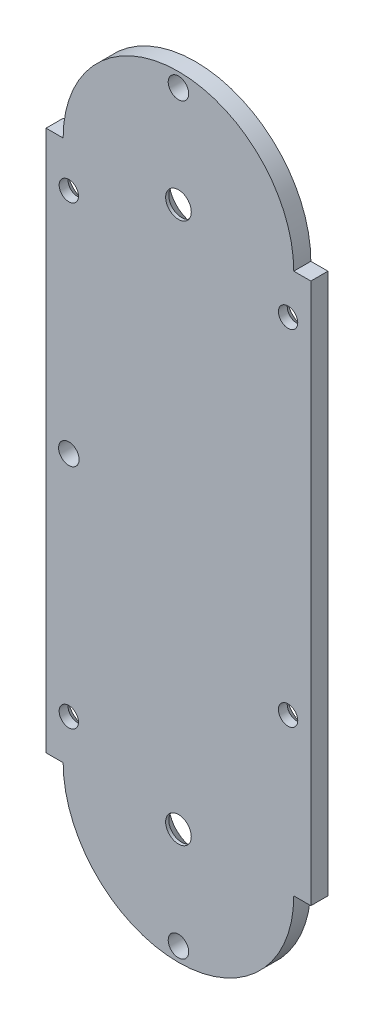
ISO-10303-21;
HEADER;
FILE_DESCRIPTION(('STEP AP214'),'2;1');
FILE_NAME('part.step','',(''),(''),'','','');
FILE_SCHEMA(('AUTOMOTIVE_DESIGN { 1 0 10303 214 1 1 1 1 }'));
ENDSEC;
DATA;
#1=APPLICATION_CONTEXT('core data for automotive mechanical design processes');
#2=APPLICATION_PROTOCOL_DEFINITION('international standard','automotive_design',2000,#1);
#3=PRODUCT_CONTEXT('',#1,'mechanical');
#4=PRODUCT('Part','Part','',(#3));
#5=PRODUCT_RELATED_PRODUCT_CATEGORY('part','',(#4));
#6=PRODUCT_DEFINITION_FORMATION('','',#4);
#7=PRODUCT_DEFINITION_CONTEXT('part definition',#1,'design');
#8=PRODUCT_DEFINITION('design','',#6,#7);
#9=PRODUCT_DEFINITION_SHAPE('','',#8);
#10=(LENGTH_UNIT() NAMED_UNIT(*) SI_UNIT(.MILLI.,.METRE.));
#11=(NAMED_UNIT(*) PLANE_ANGLE_UNIT() SI_UNIT($,.RADIAN.));
#12=(NAMED_UNIT(*) SI_UNIT($,.STERADIAN.) SOLID_ANGLE_UNIT());
#13=UNCERTAINTY_MEASURE_WITH_UNIT(LENGTH_MEASURE(1.E-05),#10,'distance_accuracy_value','');
#14=(GEOMETRIC_REPRESENTATION_CONTEXT(3) GLOBAL_UNCERTAINTY_ASSIGNED_CONTEXT((#13)) GLOBAL_UNIT_ASSIGNED_CONTEXT((#10,
#11,#12)) REPRESENTATION_CONTEXT('',''));
#15=CARTESIAN_POINT('',(0.,0.,0.));
#16=DIRECTION('',(0.,0.,1.));
#17=DIRECTION('',(1.,0.,0.));
#18=AXIS2_PLACEMENT_3D('',#15,#16,#17);
#19=CARTESIAN_POINT('',(0.,-47.5,0.));
#20=DIRECTION('',(0.,0.,1.));
#21=DIRECTION('',(1.,0.,0.));
#22=AXIS2_PLACEMENT_3D('',#19,#20,#21);
#23=PLANE('',#22);
#24=CARTESIAN_POINT('',(-19.25,0.,0.));
#25=DIRECTION('',(0.,0.,-1.));
#26=DIRECTION('',(-1.,0.,0.));
#27=AXIS2_PLACEMENT_3D('',#24,#25,#26);
#28=CIRCLE('',#27,1.8);
#29=CARTESIAN_POINT('',(-21.05,0.,0.));
#30=VERTEX_POINT('',#29);
#31=EDGE_CURVE('E183',#30,#30,#28,.T.);
#32=ORIENTED_EDGE('',*,*,#31,.F.);
#33=EDGE_LOOP('',(#32));
#34=FACE_BOUND('',#33,.T.);
#35=CARTESIAN_POINT('',(0.,65.2500000000001,0.));
#36=DIRECTION('',(0.,0.,-1.));
#37=DIRECTION('',(-1.,0.,0.));
#38=AXIS2_PLACEMENT_3D('',#35,#36,#37);
#39=CIRCLE('',#38,1.8);
#40=CARTESIAN_POINT('',(-1.79999999999997,65.2500000000001,0.));
#41=VERTEX_POINT('',#40);
#42=EDGE_CURVE('E173',#41,#41,#39,.T.);
#43=ORIENTED_EDGE('',*,*,#42,.F.);
#44=EDGE_LOOP('',(#43));
#45=FACE_BOUND('',#44,.T.);
#46=CARTESIAN_POINT('',(0.,-65.25,0.));
#47=DIRECTION('',(0.,0.,-1.));
#48=DIRECTION('',(-1.,0.,0.));
#49=AXIS2_PLACEMENT_3D('',#46,#47,#48);
#50=CIRCLE('',#49,1.8);
#51=CARTESIAN_POINT('',(-1.79999999999999,-65.25,0.));
#52=VERTEX_POINT('',#51);
#53=EDGE_CURVE('E170',#52,#52,#50,.T.);
#54=ORIENTED_EDGE('',*,*,#53,.F.);
#55=EDGE_LOOP('',(#54));
#56=FACE_BOUND('',#55,.T.);
#57=CARTESIAN_POINT('',(0.,47.5,0.));
#58=DIRECTION('',(0.,0.,-1.));
#59=DIRECTION('',(-1.,0.,0.));
#60=AXIS2_PLACEMENT_3D('',#57,#58,#59);
#61=CIRCLE('',#60,4.7);
#62=CARTESIAN_POINT('',(-4.70000000000001,47.5,0.));
#63=VERTEX_POINT('',#62);
#64=EDGE_CURVE('E221',#63,#63,#61,.T.);
#65=ORIENTED_EDGE('',*,*,#64,.F.);
#66=EDGE_LOOP('',(#65));
#67=FACE_BOUND('',#66,.T.);
#68=DIRECTION('',(0.,-1.,0.));
#69=VECTOR('',#68,1.);
#70=CARTESIAN_POINT('',(-23.2500000000001,47.5000000000001,0.));
#71=LINE('',#70,#69);
#72=CARTESIAN_POINT('',(-23.2500000000001,47.5000000000001,0.));
#73=VERTEX_POINT('',#72);
#74=CARTESIAN_POINT('',(-23.2500000000001,-47.4999999999999,0.));
#75=VERTEX_POINT('',#74);
#76=EDGE_CURVE('E140',#73,#75,#71,.T.);
#77=ORIENTED_EDGE('',*,*,#76,.F.);
#78=DIRECTION('',(-1.,0.,0.));
#79=VECTOR('',#78,1.);
#80=CARTESIAN_POINT('',(-20.25,47.5,0.));
#81=LINE('',#80,#79);
#82=CARTESIAN_POINT('',(-20.25,47.5,0.));
#83=VERTEX_POINT('',#82);
#84=EDGE_CURVE('E95',#83,#73,#81,.T.);
#85=ORIENTED_EDGE('',*,*,#84,.F.);
#86=CARTESIAN_POINT('',(0.,47.5,0.));
#87=DIRECTION('',(0.,0.,1.));
#88=DIRECTION('',(-1.,0.,0.));
#89=AXIS2_PLACEMENT_3D('',#86,#87,#88);
#90=CIRCLE('',#89,20.25);
#91=CARTESIAN_POINT('',(20.25,47.5,0.));
#92=VERTEX_POINT('',#91);
#93=EDGE_CURVE('E89',#92,#83,#90,.T.);
#94=ORIENTED_EDGE('',*,*,#93,.F.);
#95=DIRECTION('',(-1.,0.,0.));
#96=VECTOR('',#95,1.);
#97=CARTESIAN_POINT('',(23.2499999999999,47.5000000000001,0.));
#98=LINE('',#97,#96);
#99=CARTESIAN_POINT('',(23.2499999999999,47.5000000000001,0.));
#100=VERTEX_POINT('',#99);
#101=EDGE_CURVE('E130',#100,#92,#98,.T.);
#102=ORIENTED_EDGE('',*,*,#101,.F.);
#103=DIRECTION('',(0.,1.,0.));
#104=VECTOR('',#103,1.);
#105=CARTESIAN_POINT('',(23.2499999999999,-47.4999999999999,0.));
#106=LINE('',#105,#104);
#107=CARTESIAN_POINT('',(23.2499999999999,-47.4999999999999,0.));
#108=VERTEX_POINT('',#107);
#109=EDGE_CURVE('E150',#108,#100,#106,.T.);
#110=ORIENTED_EDGE('',*,*,#109,.F.);
#111=DIRECTION('',(1.,0.,0.));
#112=VECTOR('',#111,1.);
#113=CARTESIAN_POINT('',(20.25,-47.5,0.));
#114=LINE('',#113,#112);
#115=CARTESIAN_POINT('',(20.25,-47.5,0.));
#116=VERTEX_POINT('',#115);
#117=EDGE_CURVE('E148',#116,#108,#114,.T.);
#118=ORIENTED_EDGE('',*,*,#117,.F.);
#119=CARTESIAN_POINT('',(0.,-47.5,0.));
#120=DIRECTION('',(0.,0.,1.));
#121=DIRECTION('',(1.,0.,0.));
#122=AXIS2_PLACEMENT_3D('',#119,#120,#121);
#123=CIRCLE('',#122,20.25);
#124=CARTESIAN_POINT('',(-20.25,-47.5000000000001,0.));
#125=VERTEX_POINT('',#124);
#126=EDGE_CURVE('E146',#125,#116,#123,.T.);
#127=ORIENTED_EDGE('',*,*,#126,.F.);
#128=DIRECTION('',(1.,0.,0.));
#129=VECTOR('',#128,1.);
#130=CARTESIAN_POINT('',(-23.2500000000001,-47.4999999999999,0.));
#131=LINE('',#130,#129);
#132=EDGE_CURVE('E143',#75,#125,#131,.T.);
#133=ORIENTED_EDGE('',*,*,#132,.F.);
#134=EDGE_LOOP('',(#77,#85,#94,#102,#110,#118,#127,#133));
#135=FACE_BOUND('',#134,.T.);
#136=CARTESIAN_POINT('',(0.,-47.5,0.));
#137=DIRECTION('',(0.,0.,-1.));
#138=DIRECTION('',(-1.,0.,0.));
#139=AXIS2_PLACEMENT_3D('',#136,#137,#138);
#140=CIRCLE('',#139,4.7);
#141=CARTESIAN_POINT('',(-4.69999999999999,-47.5,0.));
#142=VERTEX_POINT('',#141);
#143=EDGE_CURVE('E230',#142,#142,#140,.T.);
#144=ORIENTED_EDGE('',*,*,#143,.F.);
#145=EDGE_LOOP('',(#144));
#146=FACE_BOUND('',#145,.T.);
#147=CARTESIAN_POINT('',(-19.2500000000001,40.,0.));
#148=DIRECTION('',(0.,0.,-1.));
#149=DIRECTION('',(-1.,0.,0.));
#150=AXIS2_PLACEMENT_3D('',#147,#148,#149);
#151=CIRCLE('',#150,3.15);
#152=CARTESIAN_POINT('',(-22.4000000000001,40.,0.));
#153=VERTEX_POINT('',#152);
#154=EDGE_CURVE('E212',#153,#153,#151,.T.);
#155=ORIENTED_EDGE('',*,*,#154,.F.);
#156=EDGE_LOOP('',(#155));
#157=FACE_BOUND('',#156,.T.);
#158=CARTESIAN_POINT('',(-19.2500000000001,-39.9999999999999,0.));
#159=DIRECTION('',(0.,0.,-1.));
#160=DIRECTION('',(-1.,0.,0.));
#161=AXIS2_PLACEMENT_3D('',#158,#159,#160);
#162=CIRCLE('',#161,3.15);
#163=CARTESIAN_POINT('',(-22.4000000000001,-39.9999999999999,0.));
#164=VERTEX_POINT('',#163);
#165=EDGE_CURVE('E203',#164,#164,#162,.T.);
#166=ORIENTED_EDGE('',*,*,#165,.F.);
#167=EDGE_LOOP('',(#166));
#168=FACE_BOUND('',#167,.T.);
#169=CARTESIAN_POINT('',(19.2499999999999,-20.5,0.));
#170=DIRECTION('',(0.,0.,-1.));
#171=DIRECTION('',(-1.,0.,0.));
#172=AXIS2_PLACEMENT_3D('',#169,#170,#171);
#173=CIRCLE('',#172,3.15);
#174=CARTESIAN_POINT('',(16.0999999999999,-20.5,0.));
#175=VERTEX_POINT('',#174);
#176=EDGE_CURVE('E194',#175,#175,#173,.T.);
#177=ORIENTED_EDGE('',*,*,#176,.F.);
#178=EDGE_LOOP('',(#177));
#179=FACE_BOUND('',#178,.T.);
#180=CARTESIAN_POINT('',(19.2499999999999,40.0000000000001,0.));
#181=DIRECTION('',(0.,0.,-1.));
#182=DIRECTION('',(-1.,0.,0.));
#183=AXIS2_PLACEMENT_3D('',#180,#181,#182);
#184=CIRCLE('',#183,3.15);
#185=CARTESIAN_POINT('',(16.0999999999999,40.0000000000001,0.));
#186=VERTEX_POINT('',#185);
#187=EDGE_CURVE('E169',#186,#186,#184,.T.);
#188=ORIENTED_EDGE('',*,*,#187,.F.);
#189=EDGE_LOOP('',(#188));
#190=FACE_BOUND('',#189,.T.);
#191=ADVANCED_FACE('F41',(#34,#45,#56,#67,#135,#146,#157,#168,#179,#190),#23,.F.);
#192=CARTESIAN_POINT('',(-23.2500000000001,47.5000000000001,3.));
#193=DIRECTION('',(1.,0.,0.));
#194=DIRECTION('',(0.,0.,-1.));
#195=AXIS2_PLACEMENT_3D('',#192,#193,#194);
#196=PLANE('',#195);
#197=ORIENTED_EDGE('',*,*,#76,.T.);
#198=DIRECTION('',(0.,0.,-1.));
#199=VECTOR('',#198,1.);
#200=CARTESIAN_POINT('',(-23.2500000000001,-47.4999999999999,3.));
#201=LINE('',#200,#199);
#202=CARTESIAN_POINT('',(-23.2500000000001,-47.4999999999999,3.));
#203=VERTEX_POINT('',#202);
#204=EDGE_CURVE('E11',#203,#75,#201,.T.);
#205=ORIENTED_EDGE('',*,*,#204,.F.);
#206=DIRECTION('',(0.,-1.,0.));
#207=VECTOR('',#206,1.);
#208=CARTESIAN_POINT('',(-23.2500000000001,47.5000000000001,3.));
#209=LINE('',#208,#207);
#210=CARTESIAN_POINT('',(-23.2500000000001,47.5000000000001,3.));
#211=VERTEX_POINT('',#210);
#212=EDGE_CURVE('E155',#211,#203,#209,.T.);
#213=ORIENTED_EDGE('',*,*,#212,.F.);
#214=DIRECTION('',(0.,0.,-1.));
#215=VECTOR('',#214,1.);
#216=CARTESIAN_POINT('',(-23.2500000000001,47.5000000000001,3.));
#217=LINE('',#216,#215);
#218=EDGE_CURVE('E136',#211,#73,#217,.T.);
#219=ORIENTED_EDGE('',*,*,#218,.T.);
#220=EDGE_LOOP('',(#197,#205,#213,#219));
#221=FACE_BOUND('',#220,.T.);
#222=ADVANCED_FACE('F43',(#221),#196,.F.);
#223=CARTESIAN_POINT('',(-23.2500000000001,-47.4999999999999,3.));
#224=DIRECTION('',(0.,1.,0.));
#225=DIRECTION('',(-1.,0.,0.));
#226=AXIS2_PLACEMENT_3D('',#223,#224,#225);
#227=PLANE('',#226);
#228=ORIENTED_EDGE('',*,*,#132,.T.);
#229=DIRECTION('',(0.,0.,-1.));
#230=VECTOR('',#229,1.);
#231=CARTESIAN_POINT('',(-20.25,-47.5000000000001,3.));
#232=LINE('',#231,#230);
#233=CARTESIAN_POINT('',(-20.25,-47.5000000000001,3.));
#234=VERTEX_POINT('',#233);
#235=EDGE_CURVE('E51',#234,#125,#232,.T.);
#236=ORIENTED_EDGE('',*,*,#235,.F.);
#237=DIRECTION('',(1.,0.,0.));
#238=VECTOR('',#237,1.);
#239=CARTESIAN_POINT('',(-23.2500000000001,-47.4999999999999,3.));
#240=LINE('',#239,#238);
#241=EDGE_CURVE('E103',#203,#234,#240,.T.);
#242=ORIENTED_EDGE('',*,*,#241,.F.);
#243=ORIENTED_EDGE('',*,*,#204,.T.);
#244=EDGE_LOOP('',(#228,#236,#242,#243));
#245=FACE_BOUND('',#244,.T.);
#246=ADVANCED_FACE('F279',(#245),#227,.F.);
#247=CARTESIAN_POINT('',(0.,-47.5,3.));
#248=DIRECTION('',(0.,0.,-1.));
#249=DIRECTION('',(-1.,0.,0.));
#250=AXIS2_PLACEMENT_3D('',#247,#248,#249);
#251=CYLINDRICAL_SURFACE('',#250,20.25);
#252=ORIENTED_EDGE('',*,*,#126,.T.);
#253=DIRECTION('',(0.,0.,-1.));
#254=VECTOR('',#253,1.);
#255=CARTESIAN_POINT('',(20.25,-47.5,3.));
#256=LINE('',#255,#254);
#257=CARTESIAN_POINT('',(20.25,-47.5,3.));
#258=VERTEX_POINT('',#257);
#259=EDGE_CURVE('E162',#258,#116,#256,.T.);
#260=ORIENTED_EDGE('',*,*,#259,.F.);
#261=CARTESIAN_POINT('',(0.,-47.5,3.));
#262=DIRECTION('',(0.,0.,1.));
#263=DIRECTION('',(1.,0.,0.));
#264=AXIS2_PLACEMENT_3D('',#261,#262,#263);
#265=CIRCLE('',#264,20.25);
#266=EDGE_CURVE('E240',#234,#258,#265,.T.);
#267=ORIENTED_EDGE('',*,*,#266,.F.);
#268=ORIENTED_EDGE('',*,*,#235,.T.);
#269=EDGE_LOOP('',(#252,#260,#267,#268));
#270=FACE_BOUND('',#269,.T.);
#271=ADVANCED_FACE('F457',(#270),#251,.T.);
#272=CARTESIAN_POINT('',(20.25,-47.5,3.));
#273=DIRECTION('',(0.,1.,0.));
#274=DIRECTION('',(-1.,0.,0.));
#275=AXIS2_PLACEMENT_3D('',#272,#273,#274);
#276=PLANE('',#275);
#277=ORIENTED_EDGE('',*,*,#117,.T.);
#278=DIRECTION('',(0.,0.,-1.));
#279=VECTOR('',#278,1.);
#280=CARTESIAN_POINT('',(23.2499999999999,-47.4999999999999,3.));
#281=LINE('',#280,#279);
#282=CARTESIAN_POINT('',(23.2499999999999,-47.4999999999999,3.));
#283=VERTEX_POINT('',#282);
#284=EDGE_CURVE('E159',#283,#108,#281,.T.);
#285=ORIENTED_EDGE('',*,*,#284,.F.);
#286=DIRECTION('',(1.,0.,0.));
#287=VECTOR('',#286,1.);
#288=CARTESIAN_POINT('',(20.25,-47.5,3.));
#289=LINE('',#288,#287);
#290=EDGE_CURVE('E242',#258,#283,#289,.T.);
#291=ORIENTED_EDGE('',*,*,#290,.F.);
#292=ORIENTED_EDGE('',*,*,#259,.T.);
#293=EDGE_LOOP('',(#277,#285,#291,#292));
#294=FACE_BOUND('',#293,.T.);
#295=ADVANCED_FACE('F248',(#294),#276,.F.);
#296=CARTESIAN_POINT('',(23.2499999999999,-47.4999999999999,3.));
#297=DIRECTION('',(-1.,0.,0.));
#298=DIRECTION('',(0.,0.,1.));
#299=AXIS2_PLACEMENT_3D('',#296,#297,#298);
#300=PLANE('',#299);
#301=ORIENTED_EDGE('',*,*,#109,.T.);
#302=DIRECTION('',(0.,0.,-1.));
#303=VECTOR('',#302,1.);
#304=CARTESIAN_POINT('',(23.2499999999999,47.5000000000001,3.));
#305=LINE('',#304,#303);
#306=CARTESIAN_POINT('',(23.2499999999999,47.5000000000001,3.));
#307=VERTEX_POINT('',#306);
#308=EDGE_CURVE('E131',#307,#100,#305,.T.);
#309=ORIENTED_EDGE('',*,*,#308,.F.);
#310=DIRECTION('',(0.,1.,0.));
#311=VECTOR('',#310,1.);
#312=CARTESIAN_POINT('',(23.2499999999999,-47.4999999999999,3.));
#313=LINE('',#312,#311);
#314=EDGE_CURVE('E122',#283,#307,#313,.T.);
#315=ORIENTED_EDGE('',*,*,#314,.F.);
#316=ORIENTED_EDGE('',*,*,#284,.T.);
#317=EDGE_LOOP('',(#301,#309,#315,#316));
#318=FACE_BOUND('',#317,.T.);
#319=ADVANCED_FACE('F252',(#318),#300,.F.);
#320=CARTESIAN_POINT('',(23.2499999999999,47.5000000000001,3.));
#321=DIRECTION('',(0.,-1.,0.));
#322=DIRECTION('',(1.,0.,0.));
#323=AXIS2_PLACEMENT_3D('',#320,#321,#322);
#324=PLANE('',#323);
#325=ORIENTED_EDGE('',*,*,#101,.T.);
#326=DIRECTION('',(0.,0.,-1.));
#327=VECTOR('',#326,1.);
#328=CARTESIAN_POINT('',(20.25,47.5,3.));
#329=LINE('',#328,#327);
#330=CARTESIAN_POINT('',(20.25,47.5,3.));
#331=VERTEX_POINT('',#330);
#332=EDGE_CURVE('E127',#331,#92,#329,.T.);
#333=ORIENTED_EDGE('',*,*,#332,.F.);
#334=DIRECTION('',(-1.,0.,0.));
#335=VECTOR('',#334,1.);
#336=CARTESIAN_POINT('',(23.2499999999999,47.5000000000001,3.));
#337=LINE('',#336,#335);
#338=EDGE_CURVE('E116',#307,#331,#337,.T.);
#339=ORIENTED_EDGE('',*,*,#338,.F.);
#340=ORIENTED_EDGE('',*,*,#308,.T.);
#341=EDGE_LOOP('',(#325,#333,#339,#340));
#342=FACE_BOUND('',#341,.T.);
#343=ADVANCED_FACE('F128',(#342),#324,.F.);
#344=CARTESIAN_POINT('',(0.,47.5,3.));
#345=DIRECTION('',(0.,0.,-1.));
#346=DIRECTION('',(-1.,0.,0.));
#347=AXIS2_PLACEMENT_3D('',#344,#345,#346);
#348=CYLINDRICAL_SURFACE('',#347,20.25);
#349=ORIENTED_EDGE('',*,*,#93,.T.);
#350=DIRECTION('',(0.,0.,-1.));
#351=VECTOR('',#350,1.);
#352=CARTESIAN_POINT('',(-20.25,47.5,3.));
#353=LINE('',#352,#351);
#354=CARTESIAN_POINT('',(-20.25,47.5,3.));
#355=VERTEX_POINT('',#354);
#356=EDGE_CURVE('E132',#355,#83,#353,.T.);
#357=ORIENTED_EDGE('',*,*,#356,.F.);
#358=CARTESIAN_POINT('',(0.,47.5,3.));
#359=DIRECTION('',(0.,0.,1.));
#360=DIRECTION('',(-1.,0.,0.));
#361=AXIS2_PLACEMENT_3D('',#358,#359,#360);
#362=CIRCLE('',#361,20.25);
#363=EDGE_CURVE('E120',#331,#355,#362,.T.);
#364=ORIENTED_EDGE('',*,*,#363,.F.);
#365=ORIENTED_EDGE('',*,*,#332,.T.);
#366=EDGE_LOOP('',(#349,#357,#364,#365));
#367=FACE_BOUND('',#366,.T.);
#368=ADVANCED_FACE('F134',(#367),#348,.T.);
#369=CARTESIAN_POINT('',(-20.25,47.5,3.));
#370=DIRECTION('',(0.,-1.,0.));
#371=DIRECTION('',(1.,0.,0.));
#372=AXIS2_PLACEMENT_3D('',#369,#370,#371);
#373=PLANE('',#372);
#374=ORIENTED_EDGE('',*,*,#84,.T.);
#375=ORIENTED_EDGE('',*,*,#218,.F.);
#376=DIRECTION('',(-1.,0.,0.));
#377=VECTOR('',#376,1.);
#378=CARTESIAN_POINT('',(-20.25,47.5,3.));
#379=LINE('',#378,#377);
#380=EDGE_CURVE('E60',#355,#211,#379,.T.);
#381=ORIENTED_EDGE('',*,*,#380,.F.);
#382=ORIENTED_EDGE('',*,*,#356,.T.);
#383=EDGE_LOOP('',(#374,#375,#381,#382));
#384=FACE_BOUND('',#383,.T.);
#385=ADVANCED_FACE('F260',(#384),#373,.F.);
#386=CARTESIAN_POINT('',(0.,-47.5,3.));
#387=DIRECTION('',(0.,0.,1.));
#388=DIRECTION('',(1.,0.,0.));
#389=AXIS2_PLACEMENT_3D('',#386,#387,#388);
#390=PLANE('',#389);
#391=CARTESIAN_POINT('',(-19.25,0.,3.));
#392=DIRECTION('',(0.,0.,1.));
#393=DIRECTION('',(1.,0.,0.));
#394=AXIS2_PLACEMENT_3D('',#391,#392,#393);
#395=CIRCLE('',#394,1.8);
#396=CARTESIAN_POINT('',(-17.45,0.,3.));
#397=VERTEX_POINT('',#396);
#398=EDGE_CURVE('E45',#397,#397,#395,.T.);
#399=ORIENTED_EDGE('',*,*,#398,.F.);
#400=EDGE_LOOP('',(#399));
#401=FACE_BOUND('',#400,.T.);
#402=CARTESIAN_POINT('',(0.,65.2500000000001,3.));
#403=DIRECTION('',(0.,0.,1.));
#404=DIRECTION('',(1.,0.,0.));
#405=AXIS2_PLACEMENT_3D('',#402,#403,#404);
#406=CIRCLE('',#405,1.8);
#407=CARTESIAN_POINT('',(1.80000000000003,65.2500000000001,3.));
#408=VERTEX_POINT('',#407);
#409=EDGE_CURVE('E171',#408,#408,#406,.T.);
#410=ORIENTED_EDGE('',*,*,#409,.F.);
#411=EDGE_LOOP('',(#410));
#412=FACE_BOUND('',#411,.T.);
#413=CARTESIAN_POINT('',(0.,-65.25,3.));
#414=DIRECTION('',(0.,0.,1.));
#415=DIRECTION('',(1.,0.,0.));
#416=AXIS2_PLACEMENT_3D('',#413,#414,#415);
#417=CIRCLE('',#416,1.8);
#418=CARTESIAN_POINT('',(1.80000000000001,-65.25,3.));
#419=VERTEX_POINT('',#418);
#420=EDGE_CURVE('E167',#419,#419,#417,.T.);
#421=ORIENTED_EDGE('',*,*,#420,.F.);
#422=EDGE_LOOP('',(#421));
#423=FACE_BOUND('',#422,.T.);
#424=CARTESIAN_POINT('',(19.2499999999999,40.0000000000001,3.));
#425=DIRECTION('',(0.,0.,1.));
#426=DIRECTION('',(1.,0.,0.));
#427=AXIS2_PLACEMENT_3D('',#424,#425,#426);
#428=CIRCLE('',#427,1.7);
#429=CARTESIAN_POINT('',(20.9499999999999,40.0000000000001,3.));
#430=VERTEX_POINT('',#429);
#431=EDGE_CURVE('E191',#430,#430,#428,.T.);
#432=ORIENTED_EDGE('',*,*,#431,.F.);
#433=EDGE_LOOP('',(#432));
#434=FACE_BOUND('',#433,.T.);
#435=CARTESIAN_POINT('',(19.2499999999999,-20.5,3.));
#436=DIRECTION('',(0.,0.,1.));
#437=DIRECTION('',(1.,0.,0.));
#438=AXIS2_PLACEMENT_3D('',#435,#436,#437);
#439=CIRCLE('',#438,1.7);
#440=CARTESIAN_POINT('',(20.9499999999999,-20.5,3.));
#441=VERTEX_POINT('',#440);
#442=EDGE_CURVE('E200',#441,#441,#439,.T.);
#443=ORIENTED_EDGE('',*,*,#442,.F.);
#444=EDGE_LOOP('',(#443));
#445=FACE_BOUND('',#444,.T.);
#446=CARTESIAN_POINT('',(-19.2500000000001,-39.9999999999999,3.));
#447=DIRECTION('',(0.,0.,1.));
#448=DIRECTION('',(1.,0.,0.));
#449=AXIS2_PLACEMENT_3D('',#446,#447,#448);
#450=CIRCLE('',#449,1.7);
#451=CARTESIAN_POINT('',(-17.5500000000001,-39.9999999999999,3.));
#452=VERTEX_POINT('',#451);
#453=EDGE_CURVE('E209',#452,#452,#450,.T.);
#454=ORIENTED_EDGE('',*,*,#453,.F.);
#455=EDGE_LOOP('',(#454));
#456=FACE_BOUND('',#455,.T.);
#457=CARTESIAN_POINT('',(-19.2500000000001,40.,3.));
#458=DIRECTION('',(0.,0.,1.));
#459=DIRECTION('',(1.,0.,0.));
#460=AXIS2_PLACEMENT_3D('',#457,#458,#459);
#461=CIRCLE('',#460,1.7);
#462=CARTESIAN_POINT('',(-17.5500000000001,40.,3.));
#463=VERTEX_POINT('',#462);
#464=EDGE_CURVE('E218',#463,#463,#461,.T.);
#465=ORIENTED_EDGE('',*,*,#464,.F.);
#466=EDGE_LOOP('',(#465));
#467=FACE_BOUND('',#466,.T.);
#468=CARTESIAN_POINT('',(0.,47.5,3.));
#469=DIRECTION('',(0.,0.,1.));
#470=DIRECTION('',(1.,0.,0.));
#471=AXIS2_PLACEMENT_3D('',#468,#469,#470);
#472=CIRCLE('',#471,2.25);
#473=CARTESIAN_POINT('',(2.24999999999999,47.5,3.));
#474=VERTEX_POINT('',#473);
#475=EDGE_CURVE('E227',#474,#474,#472,.T.);
#476=ORIENTED_EDGE('',*,*,#475,.F.);
#477=EDGE_LOOP('',(#476));
#478=FACE_BOUND('',#477,.T.);
#479=CARTESIAN_POINT('',(0.,-47.5,3.));
#480=DIRECTION('',(0.,0.,1.));
#481=DIRECTION('',(1.,0.,0.));
#482=AXIS2_PLACEMENT_3D('',#479,#480,#481);
#483=CIRCLE('',#482,2.25);
#484=CARTESIAN_POINT('',(2.25000000000001,-47.5,3.));
#485=VERTEX_POINT('',#484);
#486=EDGE_CURVE('E144',#485,#485,#483,.T.);
#487=ORIENTED_EDGE('',*,*,#486,.F.);
#488=EDGE_LOOP('',(#487));
#489=FACE_BOUND('',#488,.T.);
#490=ORIENTED_EDGE('',*,*,#212,.T.);
#491=ORIENTED_EDGE('',*,*,#241,.T.);
#492=ORIENTED_EDGE('',*,*,#266,.T.);
#493=ORIENTED_EDGE('',*,*,#290,.T.);
#494=ORIENTED_EDGE('',*,*,#314,.T.);
#495=ORIENTED_EDGE('',*,*,#338,.T.);
#496=ORIENTED_EDGE('',*,*,#363,.T.);
#497=ORIENTED_EDGE('',*,*,#380,.T.);
#498=EDGE_LOOP('',(#490,#491,#492,#493,#494,#495,#496,#497));
#499=FACE_BOUND('',#498,.T.);
#500=ADVANCED_FACE('F118',(#401,#412,#423,#434,#445,#456,#467,#478,#489,#499),#390,.T.);
#501=CARTESIAN_POINT('',(0.,-47.5,0.));
#502=DIRECTION('',(0.,0.,-1.));
#503=DIRECTION('',(-1.,0.,0.));
#504=AXIS2_PLACEMENT_3D('',#501,#502,#503);
#505=CYLINDRICAL_SURFACE('',#504,2.25);
#506=CARTESIAN_POINT('',(0.,-47.5,2.45));
#507=DIRECTION('',(0.,0.,-1.));
#508=DIRECTION('',(-1.,0.,0.));
#509=AXIS2_PLACEMENT_3D('',#506,#507,#508);
#510=CIRCLE('',#509,2.25);
#511=CARTESIAN_POINT('',(-2.24999999999999,-47.5,2.45));
#512=VERTEX_POINT('',#511);
#513=EDGE_CURVE('E233',#512,#512,#510,.T.);
#514=ORIENTED_EDGE('',*,*,#513,.T.);
#515=EDGE_LOOP('',(#514));
#516=FACE_BOUND('',#515,.T.);
#517=ORIENTED_EDGE('',*,*,#486,.T.);
#518=EDGE_LOOP('',(#517));
#519=FACE_BOUND('',#518,.T.);
#520=ADVANCED_FACE('F268',(#516,#519),#505,.F.);
#521=CARTESIAN_POINT('',(0.,-47.5,0.));
#522=DIRECTION('',(0.,0.,-1.));
#523=DIRECTION('',(-1.,0.,0.));
#524=AXIS2_PLACEMENT_3D('',#521,#522,#523);
#525=CONICAL_SURFACE('',#524,4.7,0.785398163397449);
#526=ORIENTED_EDGE('',*,*,#513,.F.);
#527=EDGE_LOOP('',(#526));
#528=FACE_BOUND('',#527,.T.);
#529=ORIENTED_EDGE('',*,*,#143,.T.);
#530=EDGE_LOOP('',(#529));
#531=FACE_BOUND('',#530,.T.);
#532=ADVANCED_FACE('F284',(#528,#531),#525,.F.);
#533=CARTESIAN_POINT('',(0.,47.5,0.));
#534=DIRECTION('',(0.,0.,-1.));
#535=DIRECTION('',(-1.,0.,0.));
#536=AXIS2_PLACEMENT_3D('',#533,#534,#535);
#537=CYLINDRICAL_SURFACE('',#536,2.25);
#538=CARTESIAN_POINT('',(0.,47.5,2.45));
#539=DIRECTION('',(0.,0.,-1.));
#540=DIRECTION('',(-1.,0.,0.));
#541=AXIS2_PLACEMENT_3D('',#538,#539,#540);
#542=CIRCLE('',#541,2.25);
#543=CARTESIAN_POINT('',(-2.25000000000001,47.5,2.45));
#544=VERTEX_POINT('',#543);
#545=EDGE_CURVE('E224',#544,#544,#542,.T.);
#546=ORIENTED_EDGE('',*,*,#545,.T.);
#547=EDGE_LOOP('',(#546));
#548=FACE_BOUND('',#547,.T.);
#549=ORIENTED_EDGE('',*,*,#475,.T.);
#550=EDGE_LOOP('',(#549));
#551=FACE_BOUND('',#550,.T.);
#552=ADVANCED_FACE('F288',(#548,#551),#537,.F.);
#553=CARTESIAN_POINT('',(0.,47.5,0.));
#554=DIRECTION('',(0.,0.,-1.));
#555=DIRECTION('',(-1.,0.,0.));
#556=AXIS2_PLACEMENT_3D('',#553,#554,#555);
#557=CONICAL_SURFACE('',#556,4.7,0.785398163397449);
#558=ORIENTED_EDGE('',*,*,#545,.F.);
#559=EDGE_LOOP('',(#558));
#560=FACE_BOUND('',#559,.T.);
#561=ORIENTED_EDGE('',*,*,#64,.T.);
#562=EDGE_LOOP('',(#561));
#563=FACE_BOUND('',#562,.T.);
#564=ADVANCED_FACE('F292',(#560,#563),#557,.F.);
#565=CARTESIAN_POINT('',(-19.2500000000001,40.,0.));
#566=DIRECTION('',(0.,0.,-1.));
#567=DIRECTION('',(-1.,0.,0.));
#568=AXIS2_PLACEMENT_3D('',#565,#566,#567);
#569=CYLINDRICAL_SURFACE('',#568,1.7);
#570=CARTESIAN_POINT('',(-19.2500000000001,40.,1.45));
#571=DIRECTION('',(0.,0.,-1.));
#572=DIRECTION('',(-1.,0.,0.));
#573=AXIS2_PLACEMENT_3D('',#570,#571,#572);
#574=CIRCLE('',#573,1.7);
#575=CARTESIAN_POINT('',(-20.9500000000001,40.,1.45));
#576=VERTEX_POINT('',#575);
#577=EDGE_CURVE('E215',#576,#576,#574,.T.);
#578=ORIENTED_EDGE('',*,*,#577,.T.);
#579=EDGE_LOOP('',(#578));
#580=FACE_BOUND('',#579,.T.);
#581=ORIENTED_EDGE('',*,*,#464,.T.);
#582=EDGE_LOOP('',(#581));
#583=FACE_BOUND('',#582,.T.);
#584=ADVANCED_FACE('F296',(#580,#583),#569,.F.);
#585=CARTESIAN_POINT('',(-19.2500000000001,40.,0.));
#586=DIRECTION('',(0.,0.,-1.));
#587=DIRECTION('',(-1.,0.,0.));
#588=AXIS2_PLACEMENT_3D('',#585,#586,#587);
#589=CONICAL_SURFACE('',#588,3.15,0.785398163397448);
#590=ORIENTED_EDGE('',*,*,#577,.F.);
#591=EDGE_LOOP('',(#590));
#592=FACE_BOUND('',#591,.T.);
#593=ORIENTED_EDGE('',*,*,#154,.T.);
#594=EDGE_LOOP('',(#593));
#595=FACE_BOUND('',#594,.T.);
#596=ADVANCED_FACE('F300',(#592,#595),#589,.F.);
#597=CARTESIAN_POINT('',(-19.2500000000001,-39.9999999999999,0.));
#598=DIRECTION('',(0.,0.,-1.));
#599=DIRECTION('',(-1.,0.,0.));
#600=AXIS2_PLACEMENT_3D('',#597,#598,#599);
#601=CYLINDRICAL_SURFACE('',#600,1.7);
#602=CARTESIAN_POINT('',(-19.2500000000001,-39.9999999999999,1.45));
#603=DIRECTION('',(0.,0.,-1.));
#604=DIRECTION('',(-1.,0.,0.));
#605=AXIS2_PLACEMENT_3D('',#602,#603,#604);
#606=CIRCLE('',#605,1.7);
#607=CARTESIAN_POINT('',(-20.9500000000001,-39.9999999999999,1.45));
#608=VERTEX_POINT('',#607);
#609=EDGE_CURVE('E206',#608,#608,#606,.T.);
#610=ORIENTED_EDGE('',*,*,#609,.T.);
#611=EDGE_LOOP('',(#610));
#612=FACE_BOUND('',#611,.T.);
#613=ORIENTED_EDGE('',*,*,#453,.T.);
#614=EDGE_LOOP('',(#613));
#615=FACE_BOUND('',#614,.T.);
#616=ADVANCED_FACE('F304',(#612,#615),#601,.F.);
#617=CARTESIAN_POINT('',(-19.2500000000001,-39.9999999999999,0.));
#618=DIRECTION('',(0.,0.,-1.));
#619=DIRECTION('',(-1.,0.,0.));
#620=AXIS2_PLACEMENT_3D('',#617,#618,#619);
#621=CONICAL_SURFACE('',#620,3.15,0.785398163397448);
#622=ORIENTED_EDGE('',*,*,#609,.F.);
#623=EDGE_LOOP('',(#622));
#624=FACE_BOUND('',#623,.T.);
#625=ORIENTED_EDGE('',*,*,#165,.T.);
#626=EDGE_LOOP('',(#625));
#627=FACE_BOUND('',#626,.T.);
#628=ADVANCED_FACE('F308',(#624,#627),#621,.F.);
#629=CARTESIAN_POINT('',(19.2499999999999,-20.5,0.));
#630=DIRECTION('',(0.,0.,-1.));
#631=DIRECTION('',(-1.,0.,0.));
#632=AXIS2_PLACEMENT_3D('',#629,#630,#631);
#633=CYLINDRICAL_SURFACE('',#632,1.7);
#634=CARTESIAN_POINT('',(19.2499999999999,-20.5,1.45));
#635=DIRECTION('',(0.,0.,-1.));
#636=DIRECTION('',(-1.,0.,0.));
#637=AXIS2_PLACEMENT_3D('',#634,#635,#636);
#638=CIRCLE('',#637,1.7);
#639=CARTESIAN_POINT('',(17.5499999999999,-20.5,1.45));
#640=VERTEX_POINT('',#639);
#641=EDGE_CURVE('E197',#640,#640,#638,.T.);
#642=ORIENTED_EDGE('',*,*,#641,.T.);
#643=EDGE_LOOP('',(#642));
#644=FACE_BOUND('',#643,.T.);
#645=ORIENTED_EDGE('',*,*,#442,.T.);
#646=EDGE_LOOP('',(#645));
#647=FACE_BOUND('',#646,.T.);
#648=ADVANCED_FACE('F312',(#644,#647),#633,.F.);
#649=CARTESIAN_POINT('',(19.2499999999999,-20.5,0.));
#650=DIRECTION('',(0.,0.,-1.));
#651=DIRECTION('',(-1.,0.,0.));
#652=AXIS2_PLACEMENT_3D('',#649,#650,#651);
#653=CONICAL_SURFACE('',#652,3.15,0.785398163397448);
#654=ORIENTED_EDGE('',*,*,#641,.F.);
#655=EDGE_LOOP('',(#654));
#656=FACE_BOUND('',#655,.T.);
#657=ORIENTED_EDGE('',*,*,#176,.T.);
#658=EDGE_LOOP('',(#657));
#659=FACE_BOUND('',#658,.T.);
#660=ADVANCED_FACE('F316',(#656,#659),#653,.F.);
#661=CARTESIAN_POINT('',(19.2499999999999,40.0000000000001,0.));
#662=DIRECTION('',(0.,0.,-1.));
#663=DIRECTION('',(-1.,0.,0.));
#664=AXIS2_PLACEMENT_3D('',#661,#662,#663);
#665=CYLINDRICAL_SURFACE('',#664,1.7);
#666=CARTESIAN_POINT('',(19.2499999999999,40.0000000000001,1.45));
#667=DIRECTION('',(0.,0.,-1.));
#668=DIRECTION('',(-1.,0.,0.));
#669=AXIS2_PLACEMENT_3D('',#666,#667,#668);
#670=CIRCLE('',#669,1.7);
#671=CARTESIAN_POINT('',(17.5499999999999,40.0000000000001,1.45));
#672=VERTEX_POINT('',#671);
#673=EDGE_CURVE('E188',#672,#672,#670,.T.);
#674=ORIENTED_EDGE('',*,*,#673,.T.);
#675=EDGE_LOOP('',(#674));
#676=FACE_BOUND('',#675,.T.);
#677=ORIENTED_EDGE('',*,*,#431,.T.);
#678=EDGE_LOOP('',(#677));
#679=FACE_BOUND('',#678,.T.);
#680=ADVANCED_FACE('F320',(#676,#679),#665,.F.);
#681=CARTESIAN_POINT('',(19.2499999999999,40.0000000000001,0.));
#682=DIRECTION('',(0.,0.,-1.));
#683=DIRECTION('',(-1.,0.,0.));
#684=AXIS2_PLACEMENT_3D('',#681,#682,#683);
#685=CONICAL_SURFACE('',#684,3.15,0.785398163397448);
#686=ORIENTED_EDGE('',*,*,#673,.F.);
#687=EDGE_LOOP('',(#686));
#688=FACE_BOUND('',#687,.T.);
#689=ORIENTED_EDGE('',*,*,#187,.T.);
#690=EDGE_LOOP('',(#689));
#691=FACE_BOUND('',#690,.T.);
#692=ADVANCED_FACE('F324',(#688,#691),#685,.F.);
#693=CARTESIAN_POINT('',(0.,-65.25,0.));
#694=DIRECTION('',(0.,0.,-1.));
#695=DIRECTION('',(-1.,0.,0.));
#696=AXIS2_PLACEMENT_3D('',#693,#694,#695);
#697=CYLINDRICAL_SURFACE('',#696,1.8);
#698=ORIENTED_EDGE('',*,*,#420,.T.);
#699=EDGE_LOOP('',(#698));
#700=FACE_BOUND('',#699,.T.);
#701=ORIENTED_EDGE('',*,*,#53,.T.);
#702=EDGE_LOOP('',(#701));
#703=FACE_BOUND('',#702,.T.);
#704=ADVANCED_FACE('F327',(#700,#703),#697,.F.);
#705=CARTESIAN_POINT('',(0.,65.2500000000001,0.));
#706=DIRECTION('',(0.,0.,-1.));
#707=DIRECTION('',(-1.,0.,0.));
#708=AXIS2_PLACEMENT_3D('',#705,#706,#707);
#709=CYLINDRICAL_SURFACE('',#708,1.8);
#710=ORIENTED_EDGE('',*,*,#409,.T.);
#711=EDGE_LOOP('',(#710));
#712=FACE_BOUND('',#711,.T.);
#713=ORIENTED_EDGE('',*,*,#42,.T.);
#714=EDGE_LOOP('',(#713));
#715=FACE_BOUND('',#714,.T.);
#716=ADVANCED_FACE('F331',(#712,#715),#709,.F.);
#717=CARTESIAN_POINT('',(-19.25,0.,0.));
#718=DIRECTION('',(0.,0.,-1.));
#719=DIRECTION('',(-1.,0.,0.));
#720=AXIS2_PLACEMENT_3D('',#717,#718,#719);
#721=CYLINDRICAL_SURFACE('',#720,1.8);
#722=ORIENTED_EDGE('',*,*,#398,.T.);
#723=EDGE_LOOP('',(#722));
#724=FACE_BOUND('',#723,.T.);
#725=ORIENTED_EDGE('',*,*,#31,.T.);
#726=EDGE_LOOP('',(#725));
#727=FACE_BOUND('',#726,.T.);
#728=ADVANCED_FACE('F335',(#724,#727),#721,.F.);
#729=CLOSED_SHELL('',(#191,#222,#246,#271,#295,#319,#343,#368,#385,#500,#520,#532,#552,#564,
#584,#596,#616,#628,#648,#660,#680,#692,#704,#716,#728));
#730=MANIFOLD_SOLID_BREP('B2',#729);
#731=ADVANCED_BREP_SHAPE_REPRESENTATION('',(#18,#730),#14);
#732=SHAPE_DEFINITION_REPRESENTATION(#9,#731);
ENDSEC;
END-ISO-10303-21;
